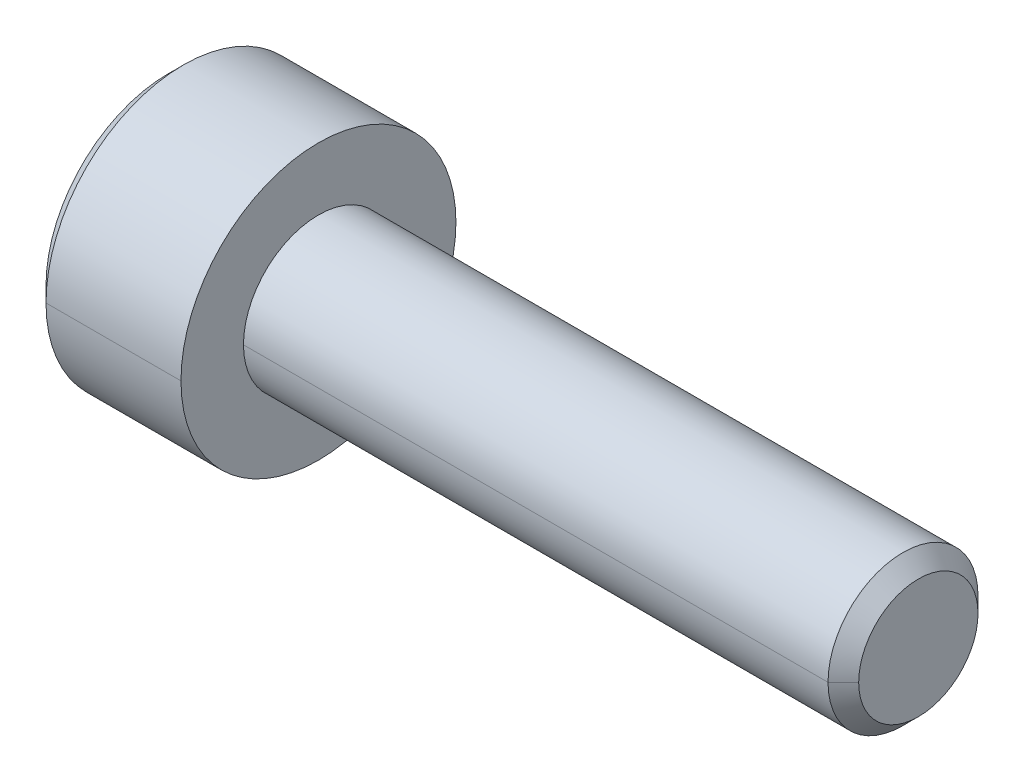
ISO-10303-21;
HEADER;
FILE_DESCRIPTION(('STEP AP214'),'2;1');
FILE_NAME('part.step','',(''),(''),'','','');
FILE_SCHEMA(('AUTOMOTIVE_DESIGN { 1 0 10303 214 1 1 1 1 }'));
ENDSEC;
DATA;
#1=APPLICATION_CONTEXT('core data for automotive mechanical design processes');
#2=APPLICATION_PROTOCOL_DEFINITION('international standard','automotive_design',2000,#1);
#3=PRODUCT_CONTEXT('',#1,'mechanical');
#4=PRODUCT('Part','Part','',(#3));
#5=PRODUCT_RELATED_PRODUCT_CATEGORY('part','',(#4));
#6=PRODUCT_DEFINITION_FORMATION('','',#4);
#7=PRODUCT_DEFINITION_CONTEXT('part definition',#1,'design');
#8=PRODUCT_DEFINITION('design','',#6,#7);
#9=PRODUCT_DEFINITION_SHAPE('','',#8);
#10=(LENGTH_UNIT() NAMED_UNIT(*) SI_UNIT(.MILLI.,.METRE.));
#11=(NAMED_UNIT(*) PLANE_ANGLE_UNIT() SI_UNIT($,.RADIAN.));
#12=(NAMED_UNIT(*) SI_UNIT($,.STERADIAN.) SOLID_ANGLE_UNIT());
#13=UNCERTAINTY_MEASURE_WITH_UNIT(LENGTH_MEASURE(1.E-05),#10,'distance_accuracy_value','');
#14=(GEOMETRIC_REPRESENTATION_CONTEXT(3) GLOBAL_UNCERTAINTY_ASSIGNED_CONTEXT((#13)) GLOBAL_UNIT_ASSIGNED_CONTEXT((#10,
#11,#12)) REPRESENTATION_CONTEXT('',''));
#15=CARTESIAN_POINT('',(0.,0.,0.));
#16=DIRECTION('',(0.,0.,1.));
#17=DIRECTION('',(1.,0.,0.));
#18=AXIS2_PLACEMENT_3D('',#15,#16,#17);
#19=CARTESIAN_POINT('',(-3.,0.,0.));
#20=DIRECTION('',(1.,0.,0.));
#21=DIRECTION('',(0.,0.,-1.));
#22=AXIS2_PLACEMENT_3D('',#19,#20,#21);
#23=PLANE('',#22);
#24=CARTESIAN_POINT('',(-3.,0.,0.));
#25=DIRECTION('',(1.,0.,0.));
#26=DIRECTION('',(0.,0.,-1.));
#27=AXIS2_PLACEMENT_3D('',#24,#25,#26);
#28=CIRCLE('',#27,2.45);
#29=CARTESIAN_POINT('',(-3.,0.,2.45));
#30=VERTEX_POINT('',#29);
#31=CARTESIAN_POINT('',(-3.,0.,-2.45));
#32=VERTEX_POINT('',#31);
#33=EDGE_CURVE('E11',#30,#32,#28,.T.);
#34=ORIENTED_EDGE('',*,*,#33,.F.);
#35=CARTESIAN_POINT('',(-3.,0.,0.));
#36=DIRECTION('',(1.,0.,0.));
#37=DIRECTION('',(0.,0.,-1.));
#38=AXIS2_PLACEMENT_3D('',#35,#36,#37);
#39=CIRCLE('',#38,2.45);
#40=EDGE_CURVE('E25',#32,#30,#39,.T.);
#41=ORIENTED_EDGE('',*,*,#40,.F.);
#42=EDGE_LOOP('',(#34,#41));
#43=FACE_BOUND('',#42,.T.);
#44=DIRECTION('',(0.,0.50000000000002,-0.866025403784427));
#45=VECTOR('',#44,1.);
#46=CARTESIAN_POINT('',(-3.,-1.4433756729741,0.));
#47=LINE('',#46,#45);
#48=CARTESIAN_POINT('',(-3.,-1.4433756729741,0.));
#49=VERTEX_POINT('',#48);
#50=CARTESIAN_POINT('',(-3.,-0.72168783648703,-1.25));
#51=VERTEX_POINT('',#50);
#52=EDGE_CURVE('E353',#49,#51,#47,.T.);
#53=ORIENTED_EDGE('',*,*,#52,.T.);
#54=DIRECTION('',(0.,1.,0.));
#55=VECTOR('',#54,1.);
#56=CARTESIAN_POINT('',(-3.,-0.72168783648703,-1.25));
#57=LINE('',#56,#55);
#58=CARTESIAN_POINT('',(-3.,0.72168783648703,-1.25));
#59=VERTEX_POINT('',#58);
#60=EDGE_CURVE('E349',#51,#59,#57,.T.);
#61=ORIENTED_EDGE('',*,*,#60,.T.);
#62=DIRECTION('',(0.,0.50000000000002,0.866025403784427));
#63=VECTOR('',#62,1.);
#64=CARTESIAN_POINT('',(-3.,0.72168783648703,-1.25));
#65=LINE('',#64,#63);
#66=CARTESIAN_POINT('',(-3.,1.4433756729741,0.));
#67=VERTEX_POINT('',#66);
#68=EDGE_CURVE('E345',#59,#67,#65,.T.);
#69=ORIENTED_EDGE('',*,*,#68,.T.);
#70=DIRECTION('',(0.,-0.50000000000002,0.866025403784427));
#71=VECTOR('',#70,1.);
#72=CARTESIAN_POINT('',(-3.,1.4433756729741,0.));
#73=LINE('',#72,#71);
#74=CARTESIAN_POINT('',(-3.,0.72168783648703,1.25));
#75=VERTEX_POINT('',#74);
#76=EDGE_CURVE('E341',#67,#75,#73,.T.);
#77=ORIENTED_EDGE('',*,*,#76,.T.);
#78=DIRECTION('',(0.,-1.,0.));
#79=VECTOR('',#78,1.);
#80=CARTESIAN_POINT('',(-3.,0.72168783648703,1.25));
#81=LINE('',#80,#79);
#82=CARTESIAN_POINT('',(-3.,-0.72168783648703,1.25));
#83=VERTEX_POINT('',#82);
#84=EDGE_CURVE('E337',#75,#83,#81,.T.);
#85=ORIENTED_EDGE('',*,*,#84,.T.);
#86=DIRECTION('',(0.,-0.50000000000002,-0.866025403784427));
#87=VECTOR('',#86,1.);
#88=CARTESIAN_POINT('',(-3.,-0.72168783648703,1.25));
#89=LINE('',#88,#87);
#90=EDGE_CURVE('E333',#83,#49,#89,.T.);
#91=ORIENTED_EDGE('',*,*,#90,.T.);
#92=EDGE_LOOP('',(#53,#61,#69,#77,#85,#91));
#93=FACE_BOUND('',#92,.T.);
#94=ADVANCED_FACE('F17',(#43,#93),#23,.F.);
#95=CARTESIAN_POINT('',(-1.5,-0.72168783648703,1.25));
#96=DIRECTION('',(0.,0.866025403784427,-0.50000000000002));
#97=DIRECTION('',(0.,0.50000000000002,0.866025403784427));
#98=AXIS2_PLACEMENT_3D('',#95,#96,#97);
#99=PLANE('',#98);
#100=ORIENTED_EDGE('',*,*,#90,.F.);
#101=DIRECTION('',(-1.,0.,0.));
#102=VECTOR('',#101,1.);
#103=CARTESIAN_POINT('',(-1.5,-0.72168783648703,1.25));
#104=LINE('',#103,#102);
#105=CARTESIAN_POINT('',(-1.5,-0.72168783648703,1.25));
#106=VERTEX_POINT('',#105);
#107=EDGE_CURVE('E328',#106,#83,#104,.T.);
#108=ORIENTED_EDGE('',*,*,#107,.F.);
#109=DIRECTION('',(0.,-0.50000000000002,-0.866025403784427));
#110=VECTOR('',#109,1.);
#111=CARTESIAN_POINT('',(-1.5,-0.72168783648703,1.25));
#112=LINE('',#111,#110);
#113=CARTESIAN_POINT('',(-1.5,-1.08253175473055,0.625000000000032));
#114=VERTEX_POINT('',#113);
#115=EDGE_CURVE('E324',#106,#114,#112,.T.);
#116=ORIENTED_EDGE('',*,*,#115,.T.);
#117=DIRECTION('',(0.,-0.50000000000002,-0.866025403784427));
#118=VECTOR('',#117,1.);
#119=CARTESIAN_POINT('',(-1.5,-0.72168783648703,1.25));
#120=LINE('',#119,#118);
#121=CARTESIAN_POINT('',(-1.5,-1.4433756729741,0.));
#122=VERTEX_POINT('',#121);
#123=EDGE_CURVE('E320',#114,#122,#120,.T.);
#124=ORIENTED_EDGE('',*,*,#123,.T.);
#125=DIRECTION('',(-1.,0.,0.));
#126=VECTOR('',#125,1.);
#127=CARTESIAN_POINT('',(-1.5,-1.4433756729741,0.));
#128=LINE('',#127,#126);
#129=EDGE_CURVE('E315',#122,#49,#128,.T.);
#130=ORIENTED_EDGE('',*,*,#129,.T.);
#131=EDGE_LOOP('',(#100,#108,#116,#124,#130));
#132=FACE_BOUND('',#131,.T.);
#133=ADVANCED_FACE('F387',(#132),#99,.T.);
#134=CARTESIAN_POINT('',(-1.5,-1.4433756729741,0.));
#135=DIRECTION('',(0.,0.866025403784427,0.50000000000002));
#136=DIRECTION('',(0.,-0.50000000000002,0.866025403784427));
#137=AXIS2_PLACEMENT_3D('',#134,#135,#136);
#138=PLANE('',#137);
#139=ORIENTED_EDGE('',*,*,#52,.F.);
#140=ORIENTED_EDGE('',*,*,#129,.F.);
#141=DIRECTION('',(0.,0.50000000000002,-0.866025403784427));
#142=VECTOR('',#141,1.);
#143=CARTESIAN_POINT('',(-1.5,-1.4433756729741,0.));
#144=LINE('',#143,#142);
#145=CARTESIAN_POINT('',(-1.5,-1.08253175473053,-0.625000000000024));
#146=VERTEX_POINT('',#145);
#147=EDGE_CURVE('E311',#122,#146,#144,.T.);
#148=ORIENTED_EDGE('',*,*,#147,.T.);
#149=DIRECTION('',(0.,0.50000000000002,-0.866025403784427));
#150=VECTOR('',#149,1.);
#151=CARTESIAN_POINT('',(-1.5,-1.4433756729741,0.));
#152=LINE('',#151,#150);
#153=CARTESIAN_POINT('',(-1.5,-0.72168783648703,-1.25));
#154=VERTEX_POINT('',#153);
#155=EDGE_CURVE('E307',#146,#154,#152,.T.);
#156=ORIENTED_EDGE('',*,*,#155,.T.);
#157=DIRECTION('',(-1.,0.,0.));
#158=VECTOR('',#157,1.);
#159=CARTESIAN_POINT('',(-1.5,-0.72168783648703,-1.25));
#160=LINE('',#159,#158);
#161=EDGE_CURVE('E302',#154,#51,#160,.T.);
#162=ORIENTED_EDGE('',*,*,#161,.T.);
#163=EDGE_LOOP('',(#139,#140,#148,#156,#162));
#164=FACE_BOUND('',#163,.T.);
#165=ADVANCED_FACE('F391',(#164),#138,.T.);
#166=CARTESIAN_POINT('',(-1.5,-0.72168783648703,-1.25));
#167=DIRECTION('',(0.,0.,1.));
#168=DIRECTION('',(1.,0.,0.));
#169=AXIS2_PLACEMENT_3D('',#166,#167,#168);
#170=PLANE('',#169);
#171=ORIENTED_EDGE('',*,*,#60,.F.);
#172=ORIENTED_EDGE('',*,*,#161,.F.);
#173=DIRECTION('',(0.,1.,0.));
#174=VECTOR('',#173,1.);
#175=CARTESIAN_POINT('',(-1.5,-0.72168783648703,-1.25));
#176=LINE('',#175,#174);
#177=CARTESIAN_POINT('',(-1.5,0.,-1.25));
#178=VERTEX_POINT('',#177);
#179=EDGE_CURVE('E298',#154,#178,#176,.T.);
#180=ORIENTED_EDGE('',*,*,#179,.T.);
#181=DIRECTION('',(0.,1.,0.));
#182=VECTOR('',#181,1.);
#183=CARTESIAN_POINT('',(-1.5,-0.72168783648703,-1.25));
#184=LINE('',#183,#182);
#185=CARTESIAN_POINT('',(-1.5,0.72168783648703,-1.25));
#186=VERTEX_POINT('',#185);
#187=EDGE_CURVE('E294',#178,#186,#184,.T.);
#188=ORIENTED_EDGE('',*,*,#187,.T.);
#189=DIRECTION('',(-1.,0.,0.));
#190=VECTOR('',#189,1.);
#191=CARTESIAN_POINT('',(-1.5,0.72168783648703,-1.25));
#192=LINE('',#191,#190);
#193=EDGE_CURVE('E289',#186,#59,#192,.T.);
#194=ORIENTED_EDGE('',*,*,#193,.T.);
#195=EDGE_LOOP('',(#171,#172,#180,#188,#194));
#196=FACE_BOUND('',#195,.T.);
#197=ADVANCED_FACE('F403',(#196),#170,.T.);
#198=CARTESIAN_POINT('',(-1.5,0.72168783648703,-1.25));
#199=DIRECTION('',(0.,-0.866025403784427,0.50000000000002));
#200=DIRECTION('',(0.,-0.50000000000002,-0.866025403784427));
#201=AXIS2_PLACEMENT_3D('',#198,#199,#200);
#202=PLANE('',#201);
#203=ORIENTED_EDGE('',*,*,#68,.F.);
#204=ORIENTED_EDGE('',*,*,#193,.F.);
#205=DIRECTION('',(0.,0.50000000000002,0.866025403784427));
#206=VECTOR('',#205,1.);
#207=CARTESIAN_POINT('',(-1.5,0.72168783648703,-1.25));
#208=LINE('',#207,#206);
#209=CARTESIAN_POINT('',(-1.5,1.08253175473055,-0.625000000000032));
#210=VERTEX_POINT('',#209);
#211=EDGE_CURVE('E285',#186,#210,#208,.T.);
#212=ORIENTED_EDGE('',*,*,#211,.T.);
#213=DIRECTION('',(0.,0.50000000000002,0.866025403784427));
#214=VECTOR('',#213,1.);
#215=CARTESIAN_POINT('',(-1.5,0.72168783648703,-1.25));
#216=LINE('',#215,#214);
#217=CARTESIAN_POINT('',(-1.5,1.4433756729741,0.));
#218=VERTEX_POINT('',#217);
#219=EDGE_CURVE('E281',#210,#218,#216,.T.);
#220=ORIENTED_EDGE('',*,*,#219,.T.);
#221=DIRECTION('',(-1.,0.,0.));
#222=VECTOR('',#221,1.);
#223=CARTESIAN_POINT('',(-1.5,1.4433756729741,0.));
#224=LINE('',#223,#222);
#225=EDGE_CURVE('E276',#218,#67,#224,.T.);
#226=ORIENTED_EDGE('',*,*,#225,.T.);
#227=EDGE_LOOP('',(#203,#204,#212,#220,#226));
#228=FACE_BOUND('',#227,.T.);
#229=ADVANCED_FACE('F409',(#228),#202,.T.);
#230=CARTESIAN_POINT('',(-1.5,1.4433756729741,0.));
#231=DIRECTION('',(0.,-0.866025403784427,-0.50000000000002));
#232=DIRECTION('',(0.,0.50000000000002,-0.866025403784427));
#233=AXIS2_PLACEMENT_3D('',#230,#231,#232);
#234=PLANE('',#233);
#235=ORIENTED_EDGE('',*,*,#76,.F.);
#236=ORIENTED_EDGE('',*,*,#225,.F.);
#237=DIRECTION('',(0.,-0.50000000000002,0.866025403784427));
#238=VECTOR('',#237,1.);
#239=CARTESIAN_POINT('',(-1.5,1.4433756729741,0.));
#240=LINE('',#239,#238);
#241=CARTESIAN_POINT('',(-1.5,1.08253175473055,0.625000000000032));
#242=VERTEX_POINT('',#241);
#243=EDGE_CURVE('E272',#218,#242,#240,.T.);
#244=ORIENTED_EDGE('',*,*,#243,.T.);
#245=DIRECTION('',(0.,-0.50000000000002,0.866025403784427));
#246=VECTOR('',#245,1.);
#247=CARTESIAN_POINT('',(-1.5,1.4433756729741,0.));
#248=LINE('',#247,#246);
#249=CARTESIAN_POINT('',(-1.5,0.72168783648703,1.25));
#250=VERTEX_POINT('',#249);
#251=EDGE_CURVE('E268',#242,#250,#248,.T.);
#252=ORIENTED_EDGE('',*,*,#251,.T.);
#253=DIRECTION('',(-1.,0.,0.));
#254=VECTOR('',#253,1.);
#255=CARTESIAN_POINT('',(-1.5,0.72168783648703,1.25));
#256=LINE('',#255,#254);
#257=EDGE_CURVE('E263',#250,#75,#256,.T.);
#258=ORIENTED_EDGE('',*,*,#257,.T.);
#259=EDGE_LOOP('',(#235,#236,#244,#252,#258));
#260=FACE_BOUND('',#259,.T.);
#261=ADVANCED_FACE('F415',(#260),#234,.T.);
#262=CARTESIAN_POINT('',(-1.5,0.72168783648703,1.25));
#263=DIRECTION('',(0.,0.,-1.));
#264=DIRECTION('',(-1.,0.,0.));
#265=AXIS2_PLACEMENT_3D('',#262,#263,#264);
#266=PLANE('',#265);
#267=ORIENTED_EDGE('',*,*,#84,.F.);
#268=ORIENTED_EDGE('',*,*,#257,.F.);
#269=DIRECTION('',(0.,-1.,0.));
#270=VECTOR('',#269,1.);
#271=CARTESIAN_POINT('',(-1.5,0.72168783648703,1.25));
#272=LINE('',#271,#270);
#273=CARTESIAN_POINT('',(-1.5,0.,1.25));
#274=VERTEX_POINT('',#273);
#275=EDGE_CURVE('E259',#250,#274,#272,.T.);
#276=ORIENTED_EDGE('',*,*,#275,.T.);
#277=DIRECTION('',(0.,-1.,0.));
#278=VECTOR('',#277,1.);
#279=CARTESIAN_POINT('',(-1.5,0.72168783648703,1.25));
#280=LINE('',#279,#278);
#281=EDGE_CURVE('E254',#274,#106,#280,.T.);
#282=ORIENTED_EDGE('',*,*,#281,.T.);
#283=ORIENTED_EDGE('',*,*,#107,.T.);
#284=EDGE_LOOP('',(#267,#268,#276,#282,#283));
#285=FACE_BOUND('',#284,.T.);
#286=ADVANCED_FACE('F419',(#285),#266,.T.);
#287=CARTESIAN_POINT('',(-1.5,0.,0.));
#288=DIRECTION('',(1.,0.,0.));
#289=DIRECTION('',(0.,0.,-1.));
#290=AXIS2_PLACEMENT_3D('',#287,#288,#289);
#291=PLANE('',#290);
#292=CARTESIAN_POINT('',(-1.5,0.,0.));
#293=DIRECTION('',(1.,0.,0.));
#294=DIRECTION('',(0.,0.,-1.));
#295=AXIS2_PLACEMENT_3D('',#292,#293,#294);
#296=CIRCLE('',#295,1.25);
#297=EDGE_CURVE('E249',#274,#114,#296,.T.);
#298=ORIENTED_EDGE('',*,*,#297,.T.);
#299=ORIENTED_EDGE('',*,*,#115,.F.);
#300=ORIENTED_EDGE('',*,*,#281,.F.);
#301=EDGE_LOOP('',(#298,#299,#300));
#302=FACE_BOUND('',#301,.T.);
#303=ADVANCED_FACE('F460',(#302),#291,.F.);
#304=CARTESIAN_POINT('',(-1.5,0.,0.));
#305=DIRECTION('',(-1.,0.,0.));
#306=DIRECTION('',(0.,1.,0.));
#307=AXIS2_PLACEMENT_3D('',#304,#305,#306);
#308=CONICAL_SURFACE('',#307,1.25,1.30899693899575);
#309=DIRECTION('',(-0.258819045102518,0.,-0.965925826289069));
#310=VECTOR('',#309,1.);
#311=CARTESIAN_POINT('',(-1.1650635094611,0.,0.));
#312=LINE('',#311,#310);
#313=CARTESIAN_POINT('',(-1.1650635094611,0.,0.));
#314=VERTEX_POINT('',#313);
#315=EDGE_CURVE('E244',#314,#178,#312,.T.);
#316=ORIENTED_EDGE('',*,*,#315,.T.);
#317=CARTESIAN_POINT('',(-1.5,0.,0.));
#318=DIRECTION('',(1.,0.,0.));
#319=DIRECTION('',(0.,0.,-1.));
#320=AXIS2_PLACEMENT_3D('',#317,#318,#319);
#321=CIRCLE('',#320,1.25);
#322=EDGE_CURVE('E239',#146,#178,#321,.T.);
#323=ORIENTED_EDGE('',*,*,#322,.F.);
#324=CARTESIAN_POINT('',(-1.5,0.,0.));
#325=DIRECTION('',(1.,0.,0.));
#326=DIRECTION('',(0.,0.,-1.));
#327=AXIS2_PLACEMENT_3D('',#324,#325,#326);
#328=CIRCLE('',#327,1.25);
#329=EDGE_CURVE('E234',#114,#146,#328,.T.);
#330=ORIENTED_EDGE('',*,*,#329,.F.);
#331=ORIENTED_EDGE('',*,*,#297,.F.);
#332=DIRECTION('',(-0.258819045102518,0.,0.965925826289069));
#333=VECTOR('',#332,1.);
#334=CARTESIAN_POINT('',(-1.1650635094611,0.,0.));
#335=LINE('',#334,#333);
#336=EDGE_CURVE('E229',#314,#274,#335,.T.);
#337=ORIENTED_EDGE('',*,*,#336,.F.);
#338=EDGE_LOOP('',(#316,#323,#330,#331,#337));
#339=FACE_BOUND('',#338,.T.);
#340=ADVANCED_FACE('F428',(#339),#308,.F.);
#341=CARTESIAN_POINT('',(-1.5,0.,0.));
#342=DIRECTION('',(-1.,0.,0.));
#343=DIRECTION('',(0.,-1.,0.));
#344=AXIS2_PLACEMENT_3D('',#341,#342,#343);
#345=CONICAL_SURFACE('',#344,1.25,1.30899693899575);
#346=ORIENTED_EDGE('',*,*,#336,.T.);
#347=CARTESIAN_POINT('',(-1.5,0.,0.));
#348=DIRECTION('',(1.,0.,0.));
#349=DIRECTION('',(0.,0.,-1.));
#350=AXIS2_PLACEMENT_3D('',#347,#348,#349);
#351=CIRCLE('',#350,1.25);
#352=EDGE_CURVE('E224',#242,#274,#351,.T.);
#353=ORIENTED_EDGE('',*,*,#352,.F.);
#354=CARTESIAN_POINT('',(-1.5,0.,0.));
#355=DIRECTION('',(1.,0.,0.));
#356=DIRECTION('',(0.,0.,-1.));
#357=AXIS2_PLACEMENT_3D('',#354,#355,#356);
#358=CIRCLE('',#357,1.25);
#359=EDGE_CURVE('E219',#210,#242,#358,.T.);
#360=ORIENTED_EDGE('',*,*,#359,.F.);
#361=CARTESIAN_POINT('',(-1.5,0.,0.));
#362=DIRECTION('',(1.,0.,0.));
#363=DIRECTION('',(0.,0.,-1.));
#364=AXIS2_PLACEMENT_3D('',#361,#362,#363);
#365=CIRCLE('',#364,1.25);
#366=EDGE_CURVE('E214',#178,#210,#365,.T.);
#367=ORIENTED_EDGE('',*,*,#366,.F.);
#368=ORIENTED_EDGE('',*,*,#315,.F.);
#369=EDGE_LOOP('',(#346,#353,#360,#367,#368));
#370=FACE_BOUND('',#369,.T.);
#371=ADVANCED_FACE('F453',(#370),#345,.F.);
#372=CARTESIAN_POINT('',(-1.5,0.,0.));
#373=DIRECTION('',(1.,0.,0.));
#374=DIRECTION('',(0.,0.,-1.));
#375=AXIS2_PLACEMENT_3D('',#372,#373,#374);
#376=PLANE('',#375);
#377=ORIENTED_EDGE('',*,*,#366,.T.);
#378=ORIENTED_EDGE('',*,*,#211,.F.);
#379=ORIENTED_EDGE('',*,*,#187,.F.);
#380=EDGE_LOOP('',(#377,#378,#379));
#381=FACE_BOUND('',#380,.T.);
#382=ADVANCED_FACE('F449',(#381),#376,.F.);
#383=CARTESIAN_POINT('',(-1.5,0.,0.));
#384=DIRECTION('',(1.,0.,0.));
#385=DIRECTION('',(0.,0.,-1.));
#386=AXIS2_PLACEMENT_3D('',#383,#384,#385);
#387=PLANE('',#386);
#388=ORIENTED_EDGE('',*,*,#219,.F.);
#389=ORIENTED_EDGE('',*,*,#359,.T.);
#390=ORIENTED_EDGE('',*,*,#243,.F.);
#391=EDGE_LOOP('',(#388,#389,#390));
#392=FACE_BOUND('',#391,.T.);
#393=ADVANCED_FACE('F442',(#392),#387,.F.);
#394=CARTESIAN_POINT('',(-1.5,0.,0.));
#395=DIRECTION('',(1.,0.,0.));
#396=DIRECTION('',(0.,0.,-1.));
#397=AXIS2_PLACEMENT_3D('',#394,#395,#396);
#398=PLANE('',#397);
#399=ORIENTED_EDGE('',*,*,#352,.T.);
#400=ORIENTED_EDGE('',*,*,#275,.F.);
#401=ORIENTED_EDGE('',*,*,#251,.F.);
#402=EDGE_LOOP('',(#399,#400,#401));
#403=FACE_BOUND('',#402,.T.);
#404=ADVANCED_FACE('F435',(#403),#398,.F.);
#405=CARTESIAN_POINT('',(-1.5,0.,0.));
#406=DIRECTION('',(1.,0.,0.));
#407=DIRECTION('',(0.,0.,-1.));
#408=AXIS2_PLACEMENT_3D('',#405,#406,#407);
#409=PLANE('',#408);
#410=ORIENTED_EDGE('',*,*,#329,.T.);
#411=ORIENTED_EDGE('',*,*,#147,.F.);
#412=ORIENTED_EDGE('',*,*,#123,.F.);
#413=EDGE_LOOP('',(#410,#411,#412));
#414=FACE_BOUND('',#413,.T.);
#415=ADVANCED_FACE('F433',(#414),#409,.F.);
#416=CARTESIAN_POINT('',(-1.5,0.,0.));
#417=DIRECTION('',(1.,0.,0.));
#418=DIRECTION('',(0.,0.,-1.));
#419=AXIS2_PLACEMENT_3D('',#416,#417,#418);
#420=PLANE('',#419);
#421=ORIENTED_EDGE('',*,*,#322,.T.);
#422=ORIENTED_EDGE('',*,*,#179,.F.);
#423=ORIENTED_EDGE('',*,*,#155,.F.);
#424=EDGE_LOOP('',(#421,#422,#423));
#425=FACE_BOUND('',#424,.T.);
#426=ADVANCED_FACE('F432',(#425),#420,.F.);
#427=CARTESIAN_POINT('',(-3.,0.,0.));
#428=DIRECTION('',(1.,0.,0.));
#429=DIRECTION('',(0.,-1.,0.));
#430=AXIS2_PLACEMENT_3D('',#427,#428,#429);
#431=CONICAL_SURFACE('',#430,2.45,0.78539816339745);
#432=DIRECTION('',(0.707106781186546,0.,0.707106781186549));
#433=VECTOR('',#432,1.);
#434=CARTESIAN_POINT('',(-3.,0.,2.45));
#435=LINE('',#434,#433);
#436=CARTESIAN_POINT('',(-2.7,0.,2.75));
#437=VERTEX_POINT('',#436);
#438=EDGE_CURVE('E210',#30,#437,#435,.T.);
#439=ORIENTED_EDGE('',*,*,#438,.T.);
#440=CARTESIAN_POINT('',(-2.7,0.,0.));
#441=DIRECTION('',(1.,0.,0.));
#442=DIRECTION('',(0.,0.,-1.));
#443=AXIS2_PLACEMENT_3D('',#440,#441,#442);
#444=CIRCLE('',#443,2.75);
#445=CARTESIAN_POINT('',(-2.7,0.,-2.75));
#446=VERTEX_POINT('',#445);
#447=EDGE_CURVE('E205',#446,#437,#444,.T.);
#448=ORIENTED_EDGE('',*,*,#447,.F.);
#449=DIRECTION('',(0.707106781186546,0.,-0.707106781186549));
#450=VECTOR('',#449,1.);
#451=CARTESIAN_POINT('',(-3.,0.,-2.45));
#452=LINE('',#451,#450);
#453=EDGE_CURVE('E200',#32,#446,#452,.T.);
#454=ORIENTED_EDGE('',*,*,#453,.F.);
#455=ORIENTED_EDGE('',*,*,#40,.T.);
#456=EDGE_LOOP('',(#439,#448,#454,#455));
#457=FACE_BOUND('',#456,.T.);
#458=ADVANCED_FACE('F362',(#457),#431,.T.);
#459=CARTESIAN_POINT('',(-3.,0.,0.));
#460=DIRECTION('',(1.,0.,0.));
#461=DIRECTION('',(0.,1.,0.));
#462=AXIS2_PLACEMENT_3D('',#459,#460,#461);
#463=CONICAL_SURFACE('',#462,2.45,0.78539816339745);
#464=ORIENTED_EDGE('',*,*,#438,.F.);
#465=ORIENTED_EDGE('',*,*,#33,.T.);
#466=ORIENTED_EDGE('',*,*,#453,.T.);
#467=CARTESIAN_POINT('',(-2.7,0.,0.));
#468=DIRECTION('',(1.,0.,0.));
#469=DIRECTION('',(0.,0.,-1.));
#470=AXIS2_PLACEMENT_3D('',#467,#468,#469);
#471=CIRCLE('',#470,2.75);
#472=EDGE_CURVE('E195',#437,#446,#471,.T.);
#473=ORIENTED_EDGE('',*,*,#472,.F.);
#474=EDGE_LOOP('',(#464,#465,#466,#473));
#475=FACE_BOUND('',#474,.T.);
#476=ADVANCED_FACE('F365',(#475),#463,.T.);
#477=CARTESIAN_POINT('',(12.,0.,0.));
#478=DIRECTION('',(1.,0.,0.));
#479=DIRECTION('',(0.,1.,0.));
#480=AXIS2_PLACEMENT_3D('',#477,#478,#479);
#481=CYLINDRICAL_SURFACE('',#480,2.75);
#482=DIRECTION('',(1.,0.,0.));
#483=VECTOR('',#482,1.);
#484=CARTESIAN_POINT('',(-2.7,0.,2.75));
#485=LINE('',#484,#483);
#486=CARTESIAN_POINT('',(0.,0.,2.75));
#487=VERTEX_POINT('',#486);
#488=EDGE_CURVE('E190',#437,#487,#485,.T.);
#489=ORIENTED_EDGE('',*,*,#488,.F.);
#490=ORIENTED_EDGE('',*,*,#472,.T.);
#491=DIRECTION('',(1.,0.,0.));
#492=VECTOR('',#491,1.);
#493=CARTESIAN_POINT('',(-2.7,0.,-2.75));
#494=LINE('',#493,#492);
#495=CARTESIAN_POINT('',(0.,0.,-2.75));
#496=VERTEX_POINT('',#495);
#497=EDGE_CURVE('E186',#446,#496,#494,.T.);
#498=ORIENTED_EDGE('',*,*,#497,.T.);
#499=CARTESIAN_POINT('',(0.,0.,0.));
#500=DIRECTION('',(1.,0.,0.));
#501=DIRECTION('',(0.,0.,-1.));
#502=AXIS2_PLACEMENT_3D('',#499,#500,#501);
#503=CIRCLE('',#502,2.75);
#504=EDGE_CURVE('E181',#487,#496,#503,.T.);
#505=ORIENTED_EDGE('',*,*,#504,.F.);
#506=EDGE_LOOP('',(#489,#490,#498,#505));
#507=FACE_BOUND('',#506,.T.);
#508=ADVANCED_FACE('F369',(#507),#481,.T.);
#509=CARTESIAN_POINT('',(0.,2.75,0.));
#510=DIRECTION('',(-1.,0.,0.));
#511=DIRECTION('',(0.,0.,1.));
#512=AXIS2_PLACEMENT_3D('',#509,#510,#511);
#513=PLANE('',#512);
#514=CARTESIAN_POINT('',(0.,0.,0.));
#515=DIRECTION('',(1.,0.,0.));
#516=DIRECTION('',(0.,0.,-1.));
#517=AXIS2_PLACEMENT_3D('',#514,#515,#516);
#518=CIRCLE('',#517,1.5);
#519=CARTESIAN_POINT('',(0.,0.,1.5));
#520=VERTEX_POINT('',#519);
#521=CARTESIAN_POINT('',(0.,0.,-1.5));
#522=VERTEX_POINT('',#521);
#523=EDGE_CURVE('E176',#520,#522,#518,.T.);
#524=ORIENTED_EDGE('',*,*,#523,.F.);
#525=CARTESIAN_POINT('',(0.,0.,0.));
#526=DIRECTION('',(1.,0.,0.));
#527=DIRECTION('',(0.,0.,-1.));
#528=AXIS2_PLACEMENT_3D('',#525,#526,#527);
#529=CIRCLE('',#528,1.5);
#530=EDGE_CURVE('E171',#522,#520,#529,.T.);
#531=ORIENTED_EDGE('',*,*,#530,.F.);
#532=EDGE_LOOP('',(#524,#531));
#533=FACE_BOUND('',#532,.T.);
#534=CARTESIAN_POINT('',(0.,0.,0.));
#535=DIRECTION('',(1.,0.,0.));
#536=DIRECTION('',(0.,0.,-1.));
#537=AXIS2_PLACEMENT_3D('',#534,#535,#536);
#538=CIRCLE('',#537,2.75);
#539=EDGE_CURVE('E166',#496,#487,#538,.T.);
#540=ORIENTED_EDGE('',*,*,#539,.T.);
#541=ORIENTED_EDGE('',*,*,#504,.T.);
#542=EDGE_LOOP('',(#540,#541));
#543=FACE_BOUND('',#542,.T.);
#544=ADVANCED_FACE('F374',(#533,#543),#513,.F.);
#545=CARTESIAN_POINT('',(12.,0.,0.));
#546=DIRECTION('',(1.,0.,0.));
#547=DIRECTION('',(0.,-1.,0.));
#548=AXIS2_PLACEMENT_3D('',#545,#546,#547);
#549=CYLINDRICAL_SURFACE('',#548,2.75);
#550=ORIENTED_EDGE('',*,*,#488,.T.);
#551=ORIENTED_EDGE('',*,*,#539,.F.);
#552=ORIENTED_EDGE('',*,*,#497,.F.);
#553=ORIENTED_EDGE('',*,*,#447,.T.);
#554=EDGE_LOOP('',(#550,#551,#552,#553));
#555=FACE_BOUND('',#554,.T.);
#556=ADVANCED_FACE('F372',(#555),#549,.T.);
#557=CARTESIAN_POINT('',(12.,0.,0.));
#558=DIRECTION('',(1.,0.,0.));
#559=DIRECTION('',(0.,-1.,0.));
#560=AXIS2_PLACEMENT_3D('',#557,#558,#559);
#561=CYLINDRICAL_SURFACE('',#560,1.5);
#562=DIRECTION('',(1.,0.,0.));
#563=VECTOR('',#562,1.);
#564=CARTESIAN_POINT('',(0.,0.,1.5));
#565=LINE('',#564,#563);
#566=CARTESIAN_POINT('',(11.6935,0.,1.5));
#567=VERTEX_POINT('',#566);
#568=EDGE_CURVE('E162',#520,#567,#565,.T.);
#569=ORIENTED_EDGE('',*,*,#568,.T.);
#570=CARTESIAN_POINT('',(11.6935,0.,0.));
#571=DIRECTION('',(1.,0.,0.));
#572=DIRECTION('',(0.,0.,-1.));
#573=AXIS2_PLACEMENT_3D('',#570,#571,#572);
#574=CIRCLE('',#573,1.5);
#575=CARTESIAN_POINT('',(11.6935,0.,-1.5));
#576=VERTEX_POINT('',#575);
#577=EDGE_CURVE('E140',#576,#567,#574,.T.);
#578=ORIENTED_EDGE('',*,*,#577,.F.);
#579=DIRECTION('',(1.,0.,0.));
#580=VECTOR('',#579,1.);
#581=CARTESIAN_POINT('',(0.,0.,-1.5));
#582=LINE('',#581,#580);
#583=EDGE_CURVE('E154',#522,#576,#582,.T.);
#584=ORIENTED_EDGE('',*,*,#583,.F.);
#585=ORIENTED_EDGE('',*,*,#530,.T.);
#586=EDGE_LOOP('',(#569,#578,#584,#585));
#587=FACE_BOUND('',#586,.T.);
#588=ADVANCED_FACE('F383',(#587),#561,.T.);
#589=CARTESIAN_POINT('',(12.,0.,0.));
#590=DIRECTION('',(1.,0.,0.));
#591=DIRECTION('',(0.,1.,0.));
#592=AXIS2_PLACEMENT_3D('',#589,#590,#591);
#593=CYLINDRICAL_SURFACE('',#592,1.5);
#594=ORIENTED_EDGE('',*,*,#568,.F.);
#595=ORIENTED_EDGE('',*,*,#523,.T.);
#596=ORIENTED_EDGE('',*,*,#583,.T.);
#597=CARTESIAN_POINT('',(11.6935,0.,0.));
#598=DIRECTION('',(1.,0.,0.));
#599=DIRECTION('',(0.,0.,-1.));
#600=AXIS2_PLACEMENT_3D('',#597,#598,#599);
#601=CIRCLE('',#600,1.5);
#602=EDGE_CURVE('E150',#567,#576,#601,.T.);
#603=ORIENTED_EDGE('',*,*,#602,.F.);
#604=EDGE_LOOP('',(#594,#595,#596,#603));
#605=FACE_BOUND('',#604,.T.);
#606=ADVANCED_FACE('F580',(#605),#593,.T.);
#607=CARTESIAN_POINT('',(11.6935,0.,0.));
#608=DIRECTION('',(-1.,0.,0.));
#609=DIRECTION('',(0.,1.,0.));
#610=AXIS2_PLACEMENT_3D('',#607,#608,#609);
#611=CONICAL_SURFACE('',#610,1.5,0.785398163397449);
#612=DIRECTION('',(-0.707106781186547,0.,-0.707106781186548));
#613=VECTOR('',#612,1.);
#614=CARTESIAN_POINT('',(12.,0.,-1.1935));
#615=LINE('',#614,#613);
#616=CARTESIAN_POINT('',(12.,0.,-1.1935));
#617=VERTEX_POINT('',#616);
#618=EDGE_CURVE('E131',#617,#576,#615,.T.);
#619=ORIENTED_EDGE('',*,*,#618,.F.);
#620=CARTESIAN_POINT('',(12.,0.,0.));
#621=DIRECTION('',(1.,0.,0.));
#622=DIRECTION('',(0.,0.,-1.));
#623=AXIS2_PLACEMENT_3D('',#620,#621,#622);
#624=CIRCLE('',#623,1.1935);
#625=CARTESIAN_POINT('',(12.,0.,1.1935));
#626=VERTEX_POINT('',#625);
#627=EDGE_CURVE('E123',#626,#617,#624,.T.);
#628=ORIENTED_EDGE('',*,*,#627,.F.);
#629=DIRECTION('',(-0.707106781186547,0.,0.707106781186548));
#630=VECTOR('',#629,1.);
#631=CARTESIAN_POINT('',(12.,0.,1.1935));
#632=LINE('',#631,#630);
#633=EDGE_CURVE('E128',#626,#567,#632,.T.);
#634=ORIENTED_EDGE('',*,*,#633,.T.);
#635=ORIENTED_EDGE('',*,*,#602,.T.);
#636=EDGE_LOOP('',(#619,#628,#634,#635));
#637=FACE_BOUND('',#636,.T.);
#638=ADVANCED_FACE('F125',(#637),#611,.T.);
#639=CARTESIAN_POINT('',(11.6935,0.,0.));
#640=DIRECTION('',(-1.,0.,0.));
#641=DIRECTION('',(0.,-1.,0.));
#642=AXIS2_PLACEMENT_3D('',#639,#640,#641);
#643=CONICAL_SURFACE('',#642,1.5,0.785398163397449);
#644=ORIENTED_EDGE('',*,*,#618,.T.);
#645=ORIENTED_EDGE('',*,*,#577,.T.);
#646=ORIENTED_EDGE('',*,*,#633,.F.);
#647=CARTESIAN_POINT('',(12.,0.,0.));
#648=DIRECTION('',(1.,0.,0.));
#649=DIRECTION('',(0.,0.,-1.));
#650=AXIS2_PLACEMENT_3D('',#647,#648,#649);
#651=CIRCLE('',#650,1.1935);
#652=EDGE_CURVE('E135',#617,#626,#651,.T.);
#653=ORIENTED_EDGE('',*,*,#652,.F.);
#654=EDGE_LOOP('',(#644,#645,#646,#653));
#655=FACE_BOUND('',#654,.T.);
#656=ADVANCED_FACE('F139',(#655),#643,.T.);
#657=CARTESIAN_POINT('',(12.,1.1935,0.));
#658=DIRECTION('',(-1.,0.,0.));
#659=DIRECTION('',(0.,0.,1.));
#660=AXIS2_PLACEMENT_3D('',#657,#658,#659);
#661=PLANE('',#660);
#662=ORIENTED_EDGE('',*,*,#652,.T.);
#663=ORIENTED_EDGE('',*,*,#627,.T.);
#664=EDGE_LOOP('',(#662,#663));
#665=FACE_BOUND('',#664,.T.);
#666=ADVANCED_FACE('F136',(#665),#661,.F.);
#667=CLOSED_SHELL('',(#94,#133,#165,#197,#229,#261,#286,#303,#340,#371,#382,#393,#404,#415,#426,
#458,#476,#508,#544,#556,#588,#606,#638,#656,#666));
#668=MANIFOLD_SOLID_BREP('B1',#667);
#669=ADVANCED_BREP_SHAPE_REPRESENTATION('',(#18,#668),#14);
#670=SHAPE_DEFINITION_REPRESENTATION(#9,#669);
ENDSEC;
END-ISO-10303-21;
